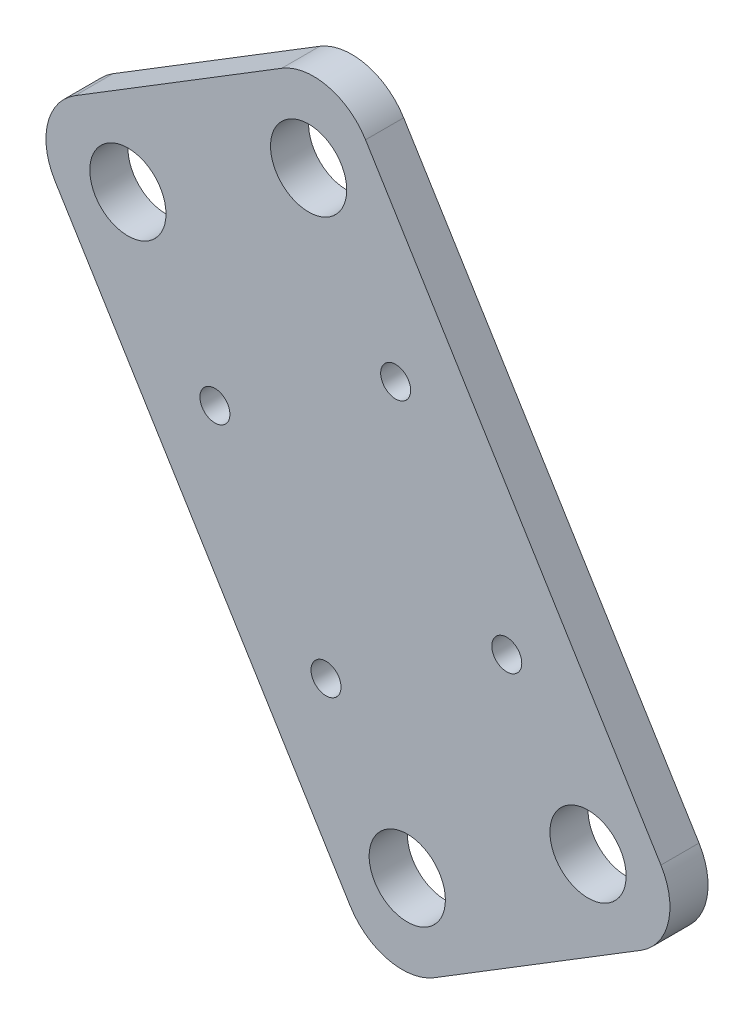
ISO-10303-21;
HEADER;
FILE_DESCRIPTION(('STEP AP214'),'2;1');
FILE_NAME('part.step','',(''),(''),'','','');
FILE_SCHEMA(('AUTOMOTIVE_DESIGN { 1 0 10303 214 1 1 1 1 }'));
ENDSEC;
DATA;
#1=APPLICATION_CONTEXT('core data for automotive mechanical design processes');
#2=APPLICATION_PROTOCOL_DEFINITION('international standard','automotive_design',2000,#1);
#3=PRODUCT_CONTEXT('',#1,'mechanical');
#4=PRODUCT('Part','Part','',(#3));
#5=PRODUCT_RELATED_PRODUCT_CATEGORY('part','',(#4));
#6=PRODUCT_DEFINITION_FORMATION('','',#4);
#7=PRODUCT_DEFINITION_CONTEXT('part definition',#1,'design');
#8=PRODUCT_DEFINITION('design','',#6,#7);
#9=PRODUCT_DEFINITION_SHAPE('','',#8);
#10=(LENGTH_UNIT() NAMED_UNIT(*) SI_UNIT(.MILLI.,.METRE.));
#11=(NAMED_UNIT(*) PLANE_ANGLE_UNIT() SI_UNIT($,.RADIAN.));
#12=(NAMED_UNIT(*) SI_UNIT($,.STERADIAN.) SOLID_ANGLE_UNIT());
#13=UNCERTAINTY_MEASURE_WITH_UNIT(LENGTH_MEASURE(1.E-05),#10,'distance_accuracy_value','');
#14=(GEOMETRIC_REPRESENTATION_CONTEXT(3) GLOBAL_UNCERTAINTY_ASSIGNED_CONTEXT((#13)) GLOBAL_UNIT_ASSIGNED_CONTEXT((#10,
#11,#12)) REPRESENTATION_CONTEXT('',''));
#15=CARTESIAN_POINT('',(0.,0.,0.));
#16=DIRECTION('',(0.,0.,1.));
#17=DIRECTION('',(1.,0.,0.));
#18=AXIS2_PLACEMENT_3D('',#15,#16,#17);
#19=CARTESIAN_POINT('',(-82.1083555414398,-162.941789071781,3.175));
#20=DIRECTION('',(0.,0.,-1.));
#21=DIRECTION('',(-1.,0.,0.));
#22=AXIS2_PLACEMENT_3D('',#19,#20,#21);
#23=CYLINDRICAL_SURFACE('',#22,5.08);
#24=CARTESIAN_POINT('',(-82.1083555414398,-162.941789071781,0.));
#25=DIRECTION('',(0.,0.,1.));
#26=DIRECTION('',(1.,0.,0.));
#27=AXIS2_PLACEMENT_3D('',#24,#25,#26);
#28=CIRCLE('',#27,5.08);
#29=CARTESIAN_POINT('',(-86.4359139950338,-165.602360031317,0.));
#30=VERTEX_POINT('',#29);
#31=CARTESIAN_POINT('',(-84.7689265009758,-158.614230618187,0.));
#32=VERTEX_POINT('',#31);
#33=EDGE_CURVE('E157',#30,#32,#28,.F.);
#34=ORIENTED_EDGE('',*,*,#33,.F.);
#35=DIRECTION('',(0.,0.,-1.));
#36=VECTOR('',#35,1.);
#37=CARTESIAN_POINT('',(-86.4359139950338,-165.602360031317,3.175));
#38=LINE('',#37,#36);
#39=CARTESIAN_POINT('',(-86.4359139950338,-165.602360031317,3.175));
#40=VERTEX_POINT('',#39);
#41=EDGE_CURVE('E11',#40,#30,#38,.T.);
#42=ORIENTED_EDGE('',*,*,#41,.F.);
#43=CARTESIAN_POINT('',(-82.1083555414398,-162.941789071781,3.175));
#44=DIRECTION('',(0.,0.,1.));
#45=DIRECTION('',(1.,0.,0.));
#46=AXIS2_PLACEMENT_3D('',#43,#44,#45);
#47=CIRCLE('',#46,5.08);
#48=CARTESIAN_POINT('',(-84.7689265009758,-158.614230618187,3.175));
#49=VERTEX_POINT('',#48);
#50=EDGE_CURVE('E273',#40,#49,#47,.F.);
#51=ORIENTED_EDGE('',*,*,#50,.T.);
#52=DIRECTION('',(0.,0.,-1.));
#53=VECTOR('',#52,1.);
#54=CARTESIAN_POINT('',(-84.7689265009758,-158.614230618187,3.175));
#55=LINE('',#54,#53);
#56=EDGE_CURVE('E90',#49,#32,#55,.T.);
#57=ORIENTED_EDGE('',*,*,#56,.T.);
#58=EDGE_LOOP('',(#34,#42,#51,#57));
#59=FACE_BOUND('',#58,.T.);
#60=ADVANCED_FACE('F39',(#59),#23,.T.);
#61=CARTESIAN_POINT('',(-136.611839550378,-83.9885808439331,3.175));
#62=DIRECTION('',(0.851881585353164,0.523734440853549,0.));
#63=DIRECTION('',(-0.523734440853549,0.851881585353164,0.));
#64=AXIS2_PLACEMENT_3D('',#61,#62,#63);
#65=PLANE('',#64);
#66=DIRECTION('',(0.523734440853549,-0.851881585353164,0.));
#67=VECTOR('',#66,1.);
#68=CARTESIAN_POINT('',(-136.611839550378,-83.9885808439331,0.));
#69=LINE('',#68,#67);
#70=CARTESIAN_POINT('',(-61.8256326193256,-205.632275727062,0.));
#71=VERTEX_POINT('',#70);
#72=EDGE_CURVE('E155',#30,#71,#69,.T.);
#73=ORIENTED_EDGE('',*,*,#72,.T.);
#74=DIRECTION('',(0.,0.,-1.));
#75=VECTOR('',#74,1.);
#76=CARTESIAN_POINT('',(-61.8256326193256,-205.632275727062,3.175));
#77=LINE('',#76,#75);
#78=CARTESIAN_POINT('',(-61.8256326193256,-205.632275727062,3.175));
#79=VERTEX_POINT('',#78);
#80=EDGE_CURVE('E48',#79,#71,#77,.T.);
#81=ORIENTED_EDGE('',*,*,#80,.F.);
#82=DIRECTION('',(0.523734440853549,-0.851881585353164,0.));
#83=VECTOR('',#82,1.);
#84=CARTESIAN_POINT('',(-136.611839550378,-83.9885808439331,3.175));
#85=LINE('',#84,#83);
#86=EDGE_CURVE('E275',#40,#79,#85,.T.);
#87=ORIENTED_EDGE('',*,*,#86,.F.);
#88=ORIENTED_EDGE('',*,*,#41,.T.);
#89=EDGE_LOOP('',(#73,#81,#87,#88));
#90=FACE_BOUND('',#89,.T.);
#91=ADVANCED_FACE('F156',(#90),#65,.F.);
#92=CARTESIAN_POINT('',(-57.4980741657315,-202.971704767526,3.175));
#93=DIRECTION('',(0.,0.,-1.));
#94=DIRECTION('',(-1.,0.,0.));
#95=AXIS2_PLACEMENT_3D('',#92,#93,#94);
#96=CYLINDRICAL_SURFACE('',#95,5.07999999999999);
#97=CARTESIAN_POINT('',(-57.4980741657315,-202.971704767526,0.));
#98=DIRECTION('',(0.,0.,1.));
#99=DIRECTION('',(1.,0.,0.));
#100=AXIS2_PLACEMENT_3D('',#97,#98,#99);
#101=CIRCLE('',#100,5.07999999999999);
#102=CARTESIAN_POINT('',(-54.8375032061955,-207.29926322112,0.));
#103=VERTEX_POINT('',#102);
#104=EDGE_CURVE('E149',#71,#103,#101,.T.);
#105=ORIENTED_EDGE('',*,*,#104,.T.);
#106=DIRECTION('',(0.,0.,-1.));
#107=VECTOR('',#106,1.);
#108=CARTESIAN_POINT('',(-54.8375032061955,-207.29926322112,3.175));
#109=LINE('',#108,#107);
#110=CARTESIAN_POINT('',(-54.8375032061955,-207.29926322112,3.175));
#111=VERTEX_POINT('',#110);
#112=EDGE_CURVE('E140',#111,#103,#109,.T.);
#113=ORIENTED_EDGE('',*,*,#112,.F.);
#114=CARTESIAN_POINT('',(-57.4980741657315,-202.971704767526,3.175));
#115=DIRECTION('',(0.,0.,1.));
#116=DIRECTION('',(1.,0.,0.));
#117=AXIS2_PLACEMENT_3D('',#114,#115,#116);
#118=CIRCLE('',#117,5.07999999999999);
#119=EDGE_CURVE('E151',#79,#111,#118,.T.);
#120=ORIENTED_EDGE('',*,*,#119,.F.);
#121=ORIENTED_EDGE('',*,*,#80,.T.);
#122=EDGE_LOOP('',(#105,#113,#120,#121));
#123=FACE_BOUND('',#122,.T.);
#124=ADVANCED_FACE('F147',(#123),#96,.T.);
#125=CARTESIAN_POINT('',(77.4467778905888,-125.971253336723,3.175));
#126=DIRECTION('',(-0.523734440853548,0.851881585353165,0.));
#127=DIRECTION('',(-0.851881585353165,-0.523734440853548,0.));
#128=AXIS2_PLACEMENT_3D('',#125,#126,#127);
#129=PLANE('',#128);
#130=DIRECTION('',(0.851881585353165,0.523734440853548,0.));
#131=VECTOR('',#130,1.);
#132=CARTESIAN_POINT('',(77.4467778905888,-125.971253336723,0.));
#133=LINE('',#132,#131);
#134=CARTESIAN_POINT('',(-37.6144428351193,-196.71057337464,0.));
#135=VERTEX_POINT('',#134);
#136=EDGE_CURVE('E159',#103,#135,#133,.T.);
#137=ORIENTED_EDGE('',*,*,#136,.T.);
#138=DIRECTION('',(0.,0.,-1.));
#139=VECTOR('',#138,1.);
#140=CARTESIAN_POINT('',(-37.6144428351193,-196.71057337464,3.175));
#141=LINE('',#140,#139);
#142=CARTESIAN_POINT('',(-37.6144428351193,-196.71057337464,3.175));
#143=VERTEX_POINT('',#142);
#144=EDGE_CURVE('E133',#143,#135,#141,.T.);
#145=ORIENTED_EDGE('',*,*,#144,.F.);
#146=DIRECTION('',(0.851881585353165,0.523734440853548,0.));
#147=VECTOR('',#146,1.);
#148=CARTESIAN_POINT('',(77.4467778905888,-125.971253336723,3.175));
#149=LINE('',#148,#147);
#150=EDGE_CURVE('E280',#111,#143,#149,.T.);
#151=ORIENTED_EDGE('',*,*,#150,.F.);
#152=ORIENTED_EDGE('',*,*,#112,.T.);
#153=EDGE_LOOP('',(#137,#145,#151,#152));
#154=FACE_BOUND('',#153,.T.);
#155=ADVANCED_FACE('F231',(#154),#129,.F.);
#156=CARTESIAN_POINT('',(-40.2750137946553,-192.383014921046,3.175));
#157=DIRECTION('',(0.,0.,-1.));
#158=DIRECTION('',(-1.,0.,0.));
#159=AXIS2_PLACEMENT_3D('',#156,#157,#158);
#160=CYLINDRICAL_SURFACE('',#159,5.08);
#161=CARTESIAN_POINT('',(-40.2750137946553,-192.383014921046,0.));
#162=DIRECTION('',(0.,0.,1.));
#163=DIRECTION('',(1.,0.,0.));
#164=AXIS2_PLACEMENT_3D('',#161,#162,#163);
#165=CIRCLE('',#164,5.08);
#166=CARTESIAN_POINT('',(-35.9474553410612,-189.722443961509,0.));
#167=VERTEX_POINT('',#166);
#168=EDGE_CURVE('E167',#135,#167,#165,.T.);
#169=ORIENTED_EDGE('',*,*,#168,.T.);
#170=DIRECTION('',(0.,0.,-1.));
#171=VECTOR('',#170,1.);
#172=CARTESIAN_POINT('',(-35.9474553410612,-189.722443961509,3.175));
#173=LINE('',#172,#171);
#174=CARTESIAN_POINT('',(-35.9474553410612,-189.722443961509,3.175));
#175=VERTEX_POINT('',#174);
#176=EDGE_CURVE('E131',#175,#167,#173,.T.);
#177=ORIENTED_EDGE('',*,*,#176,.F.);
#178=CARTESIAN_POINT('',(-40.2750137946553,-192.383014921046,3.175));
#179=DIRECTION('',(0.,0.,1.));
#180=DIRECTION('',(1.,0.,0.));
#181=AXIS2_PLACEMENT_3D('',#178,#179,#180);
#182=CIRCLE('',#181,5.08);
#183=EDGE_CURVE('E124',#143,#175,#182,.T.);
#184=ORIENTED_EDGE('',*,*,#183,.F.);
#185=ORIENTED_EDGE('',*,*,#144,.T.);
#186=EDGE_LOOP('',(#169,#177,#184,#185));
#187=FACE_BOUND('',#186,.T.);
#188=ADVANCED_FACE('F234',(#187),#160,.T.);
#189=CARTESIAN_POINT('',(-110.733662272114,-68.0787490783808,3.175));
#190=DIRECTION('',(-0.851881585353164,-0.523734440853549,0.));
#191=DIRECTION('',(0.523734440853549,-0.851881585353164,0.));
#192=AXIS2_PLACEMENT_3D('',#189,#190,#191);
#193=PLANE('',#192);
#194=DIRECTION('',(-0.523734440853549,0.851881585353164,0.));
#195=VECTOR('',#194,1.);
#196=CARTESIAN_POINT('',(-110.733662272114,-68.0787490783808,0.));
#197=LINE('',#196,#195);
#198=CARTESIAN_POINT('',(-60.5577367167694,-149.692528265764,0.));
#199=VERTEX_POINT('',#198);
#200=EDGE_CURVE('E130',#167,#199,#197,.T.);
#201=ORIENTED_EDGE('',*,*,#200,.T.);
#202=DIRECTION('',(0.,0.,-1.));
#203=VECTOR('',#202,1.);
#204=CARTESIAN_POINT('',(-60.5577367167694,-149.692528265764,3.175));
#205=LINE('',#204,#203);
#206=CARTESIAN_POINT('',(-60.5577367167694,-149.692528265764,3.175));
#207=VERTEX_POINT('',#206);
#208=EDGE_CURVE('E115',#207,#199,#205,.T.);
#209=ORIENTED_EDGE('',*,*,#208,.F.);
#210=DIRECTION('',(-0.523734440853549,0.851881585353164,0.));
#211=VECTOR('',#210,1.);
#212=CARTESIAN_POINT('',(-110.733662272114,-68.0787490783808,3.175));
#213=LINE('',#212,#211);
#214=EDGE_CURVE('E118',#175,#207,#213,.T.);
#215=ORIENTED_EDGE('',*,*,#214,.F.);
#216=ORIENTED_EDGE('',*,*,#176,.T.);
#217=EDGE_LOOP('',(#201,#209,#215,#216));
#218=FACE_BOUND('',#217,.T.);
#219=ADVANCED_FACE('F129',(#218),#193,.F.);
#220=CARTESIAN_POINT('',(-64.8852951703635,-152.3530992253,3.175));
#221=DIRECTION('',(0.,0.,-1.));
#222=DIRECTION('',(-1.,0.,0.));
#223=AXIS2_PLACEMENT_3D('',#220,#221,#222);
#224=CYLINDRICAL_SURFACE('',#223,5.07999999999999);
#225=CARTESIAN_POINT('',(-64.8852951703635,-152.3530992253,0.));
#226=DIRECTION('',(0.,0.,1.));
#227=DIRECTION('',(1.,0.,0.));
#228=AXIS2_PLACEMENT_3D('',#225,#226,#227);
#229=CIRCLE('',#228,5.07999999999999);
#230=CARTESIAN_POINT('',(-67.5458661298996,-148.025540771706,0.));
#231=VERTEX_POINT('',#230);
#232=EDGE_CURVE('E171',#199,#231,#229,.T.);
#233=ORIENTED_EDGE('',*,*,#232,.T.);
#234=DIRECTION('',(0.,0.,-1.));
#235=VECTOR('',#234,1.);
#236=CARTESIAN_POINT('',(-67.5458661298996,-148.025540771706,3.175));
#237=LINE('',#236,#235);
#238=CARTESIAN_POINT('',(-67.5458661298996,-148.025540771706,3.175));
#239=VERTEX_POINT('',#238);
#240=EDGE_CURVE('E117',#239,#231,#237,.T.);
#241=ORIENTED_EDGE('',*,*,#240,.F.);
#242=CARTESIAN_POINT('',(-64.8852951703635,-152.3530992253,3.175));
#243=DIRECTION('',(0.,0.,1.));
#244=DIRECTION('',(1.,0.,0.));
#245=AXIS2_PLACEMENT_3D('',#242,#243,#244);
#246=CIRCLE('',#245,5.07999999999999);
#247=EDGE_CURVE('E110',#207,#239,#246,.T.);
#248=ORIENTED_EDGE('',*,*,#247,.F.);
#249=ORIENTED_EDGE('',*,*,#208,.T.);
#250=EDGE_LOOP('',(#233,#241,#248,#249));
#251=FACE_BOUND('',#250,.T.);
#252=ADVANCED_FACE('F113',(#251),#224,.T.);
#253=CARTESIAN_POINT('',(-58.0500913940736,-165.895810332094,3.175));
#254=DIRECTION('',(0.,0.,-1.));
#255=DIRECTION('',(-1.,0.,0.));
#256=AXIS2_PLACEMENT_3D('',#253,#254,#255);
#257=CYLINDRICAL_SURFACE('',#256,1.25);
#258=CARTESIAN_POINT('',(-58.0500913940736,-165.895810332094,3.175));
#259=DIRECTION('',(0.,0.,1.));
#260=DIRECTION('',(1.,0.,0.));
#261=AXIS2_PLACEMENT_3D('',#258,#259,#260);
#262=CIRCLE('',#261,1.25);
#263=CARTESIAN_POINT('',(-56.8000913940736,-165.895810332094,3.175));
#264=VERTEX_POINT('',#263);
#265=EDGE_CURVE('E197',#264,#264,#262,.T.);
#266=ORIENTED_EDGE('',*,*,#265,.T.);
#267=EDGE_LOOP('',(#266));
#268=FACE_BOUND('',#267,.T.);
#269=CARTESIAN_POINT('',(-58.0500913940736,-165.895810332094,0.));
#270=DIRECTION('',(0.,0.,1.));
#271=DIRECTION('',(1.,0.,0.));
#272=AXIS2_PLACEMENT_3D('',#269,#270,#271);
#273=CIRCLE('',#272,1.25);
#274=CARTESIAN_POINT('',(-56.8000913940736,-165.895810332094,0.));
#275=VERTEX_POINT('',#274);
#276=EDGE_CURVE('E189',#275,#275,#273,.T.);
#277=ORIENTED_EDGE('',*,*,#276,.F.);
#278=EDGE_LOOP('',(#277));
#279=FACE_BOUND('',#278,.T.);
#280=ADVANCED_FACE('F242',(#268,#279),#257,.F.);
#281=CARTESIAN_POINT('',(-73.1093725383528,-175.154214698806,3.175));
#282=DIRECTION('',(0.,0.,-1.));
#283=DIRECTION('',(-1.,0.,0.));
#284=AXIS2_PLACEMENT_3D('',#281,#282,#283);
#285=CYLINDRICAL_SURFACE('',#284,1.25);
#286=CARTESIAN_POINT('',(-73.1093725383528,-175.154214698806,3.175));
#287=DIRECTION('',(0.,0.,1.));
#288=DIRECTION('',(1.,0.,0.));
#289=AXIS2_PLACEMENT_3D('',#286,#287,#288);
#290=CIRCLE('',#289,1.25);
#291=CARTESIAN_POINT('',(-71.8593725383528,-175.154214698806,3.175));
#292=VERTEX_POINT('',#291);
#293=EDGE_CURVE('E202',#292,#292,#290,.T.);
#294=ORIENTED_EDGE('',*,*,#293,.T.);
#295=EDGE_LOOP('',(#294));
#296=FACE_BOUND('',#295,.T.);
#297=CARTESIAN_POINT('',(-73.1093725383528,-175.154214698806,0.));
#298=DIRECTION('',(0.,0.,1.));
#299=DIRECTION('',(1.,0.,0.));
#300=AXIS2_PLACEMENT_3D('',#297,#298,#299);
#301=CIRCLE('',#300,1.25);
#302=CARTESIAN_POINT('',(-71.8593725383528,-175.154214698806,0.));
#303=VERTEX_POINT('',#302);
#304=EDGE_CURVE('E186',#303,#303,#301,.T.);
#305=ORIENTED_EDGE('',*,*,#304,.F.);
#306=EDGE_LOOP('',(#305));
#307=FACE_BOUND('',#306,.T.);
#308=ADVANCED_FACE('F258',(#296,#307),#285,.F.);
#309=CARTESIAN_POINT('',(-80.3613231881573,-163.358535945295,3.175));
#310=DIRECTION('',(0.,0.,-1.));
#311=DIRECTION('',(-1.,0.,0.));
#312=AXIS2_PLACEMENT_3D('',#309,#310,#311);
#313=CYLINDRICAL_SURFACE('',#312,3.175);
#314=CARTESIAN_POINT('',(-80.3613231881573,-163.358535945295,3.175));
#315=DIRECTION('',(0.,0.,1.));
#316=DIRECTION('',(1.,0.,0.));
#317=AXIS2_PLACEMENT_3D('',#314,#315,#316);
#318=CIRCLE('',#317,3.175);
#319=CARTESIAN_POINT('',(-77.1863231881573,-163.358535945295,3.175));
#320=VERTEX_POINT('',#319);
#321=EDGE_CURVE('E293',#320,#320,#318,.T.);
#322=ORIENTED_EDGE('',*,*,#321,.T.);
#323=EDGE_LOOP('',(#322));
#324=FACE_BOUND('',#323,.T.);
#325=CARTESIAN_POINT('',(-80.3613231881573,-163.358535945295,0.));
#326=DIRECTION('',(0.,0.,1.));
#327=DIRECTION('',(1.,0.,0.));
#328=AXIS2_PLACEMENT_3D('',#325,#326,#327);
#329=CIRCLE('',#328,3.175);
#330=CARTESIAN_POINT('',(-77.1863231881573,-163.358535945295,0.));
#331=VERTEX_POINT('',#330);
#332=EDGE_CURVE('E183',#331,#331,#329,.T.);
#333=ORIENTED_EDGE('',*,*,#332,.F.);
#334=EDGE_LOOP('',(#333));
#335=FACE_BOUND('',#334,.T.);
#336=ADVANCED_FACE('F254',(#324,#335),#313,.F.);
#337=CARTESIAN_POINT('',(-65.302042043878,-154.100131578583,3.175));
#338=DIRECTION('',(0.,0.,-1.));
#339=DIRECTION('',(-1.,0.,0.));
#340=AXIS2_PLACEMENT_3D('',#337,#338,#339);
#341=CYLINDRICAL_SURFACE('',#340,3.175);
#342=CARTESIAN_POINT('',(-65.302042043878,-154.100131578583,3.175));
#343=DIRECTION('',(0.,0.,1.));
#344=DIRECTION('',(1.,0.,0.));
#345=AXIS2_PLACEMENT_3D('',#342,#343,#344);
#346=CIRCLE('',#345,3.175);
#347=CARTESIAN_POINT('',(-62.127042043878,-154.100131578583,3.175));
#348=VERTEX_POINT('',#347);
#349=EDGE_CURVE('E290',#348,#348,#346,.T.);
#350=ORIENTED_EDGE('',*,*,#349,.T.);
#351=EDGE_LOOP('',(#350));
#352=FACE_BOUND('',#351,.T.);
#353=CARTESIAN_POINT('',(-65.302042043878,-154.100131578583,0.));
#354=DIRECTION('',(0.,0.,1.));
#355=DIRECTION('',(1.,0.,0.));
#356=AXIS2_PLACEMENT_3D('',#353,#354,#355);
#357=CIRCLE('',#356,3.175);
#358=CARTESIAN_POINT('',(-62.127042043878,-154.100131578583,0.));
#359=VERTEX_POINT('',#358);
#360=EDGE_CURVE('E180',#359,#359,#357,.T.);
#361=ORIENTED_EDGE('',*,*,#360,.F.);
#362=EDGE_LOOP('',(#361));
#363=FACE_BOUND('',#362,.T.);
#364=ADVANCED_FACE('F250',(#352,#363),#341,.F.);
#365=CARTESIAN_POINT('',(-42.0220461479378,-191.966268047531,3.175));
#366=DIRECTION('',(0.,0.,-1.));
#367=DIRECTION('',(-1.,0.,0.));
#368=AXIS2_PLACEMENT_3D('',#365,#366,#367);
#369=CYLINDRICAL_SURFACE('',#368,3.175);
#370=CARTESIAN_POINT('',(-42.0220461479378,-191.966268047531,3.175));
#371=DIRECTION('',(0.,0.,1.));
#372=DIRECTION('',(1.,0.,0.));
#373=AXIS2_PLACEMENT_3D('',#370,#371,#372);
#374=CIRCLE('',#373,3.175);
#375=CARTESIAN_POINT('',(-38.8470461479378,-191.966268047531,3.175));
#376=VERTEX_POINT('',#375);
#377=EDGE_CURVE('E287',#376,#376,#374,.T.);
#378=ORIENTED_EDGE('',*,*,#377,.T.);
#379=EDGE_LOOP('',(#378));
#380=FACE_BOUND('',#379,.T.);
#381=CARTESIAN_POINT('',(-42.0220461479378,-191.966268047531,0.));
#382=DIRECTION('',(0.,0.,1.));
#383=DIRECTION('',(1.,0.,0.));
#384=AXIS2_PLACEMENT_3D('',#381,#382,#383);
#385=CIRCLE('',#384,3.175);
#386=CARTESIAN_POINT('',(-38.8470461479378,-191.966268047531,0.));
#387=VERTEX_POINT('',#386);
#388=EDGE_CURVE('E177',#387,#387,#385,.T.);
#389=ORIENTED_EDGE('',*,*,#388,.F.);
#390=EDGE_LOOP('',(#389));
#391=FACE_BOUND('',#390,.T.);
#392=ADVANCED_FACE('F246',(#380,#391),#369,.F.);
#393=CARTESIAN_POINT('',(-57.081327292217,-201.224672414243,3.175));
#394=DIRECTION('',(0.,0.,-1.));
#395=DIRECTION('',(-1.,0.,0.));
#396=AXIS2_PLACEMENT_3D('',#393,#394,#395);
#397=CYLINDRICAL_SURFACE('',#396,3.175);
#398=CARTESIAN_POINT('',(-57.081327292217,-201.224672414243,3.175));
#399=DIRECTION('',(0.,0.,1.));
#400=DIRECTION('',(1.,0.,0.));
#401=AXIS2_PLACEMENT_3D('',#398,#399,#400);
#402=CIRCLE('',#401,3.175);
#403=CARTESIAN_POINT('',(-53.906327292217,-201.224672414243,3.175));
#404=VERTEX_POINT('',#403);
#405=EDGE_CURVE('E284',#404,#404,#402,.T.);
#406=ORIENTED_EDGE('',*,*,#405,.T.);
#407=EDGE_LOOP('',(#406));
#408=FACE_BOUND('',#407,.T.);
#409=CARTESIAN_POINT('',(-57.081327292217,-201.224672414243,0.));
#410=DIRECTION('',(0.,0.,1.));
#411=DIRECTION('',(1.,0.,0.));
#412=AXIS2_PLACEMENT_3D('',#409,#410,#411);
#413=CIRCLE('',#412,3.175);
#414=CARTESIAN_POINT('',(-53.906327292217,-201.224672414243,0.));
#415=VERTEX_POINT('',#414);
#416=EDGE_CURVE('E174',#415,#415,#413,.T.);
#417=ORIENTED_EDGE('',*,*,#416,.F.);
#418=EDGE_LOOP('',(#417));
#419=FACE_BOUND('',#418,.T.);
#420=ADVANCED_FACE('F219',(#408,#419),#397,.F.);
#421=CARTESIAN_POINT('',(47.5153545958086,-77.2862207337896,3.175));
#422=DIRECTION('',(0.523734440853548,-0.851881585353165,0.));
#423=DIRECTION('',(0.851881585353165,0.523734440853548,0.));
#424=AXIS2_PLACEMENT_3D('',#421,#422,#423);
#425=PLANE('',#424);
#426=DIRECTION('',(-0.851881585353165,-0.523734440853548,0.));
#427=VECTOR('',#426,1.);
#428=CARTESIAN_POINT('',(47.5153545958086,-77.2862207337896,0.));
#429=LINE('',#428,#427);
#430=EDGE_CURVE('E83',#231,#32,#429,.T.);
#431=ORIENTED_EDGE('',*,*,#430,.T.);
#432=ORIENTED_EDGE('',*,*,#56,.F.);
#433=DIRECTION('',(-0.851881585353165,-0.523734440853548,0.));
#434=VECTOR('',#433,1.);
#435=CARTESIAN_POINT('',(47.5153545958086,-77.2862207337896,3.175));
#436=LINE('',#435,#434);
#437=EDGE_CURVE('E56',#239,#49,#436,.T.);
#438=ORIENTED_EDGE('',*,*,#437,.F.);
#439=ORIENTED_EDGE('',*,*,#240,.T.);
#440=EDGE_LOOP('',(#431,#432,#438,#439));
#441=FACE_BOUND('',#440,.T.);
#442=ADVANCED_FACE('F212',(#441),#425,.F.);
#443=CARTESIAN_POINT('',(-48.7916870273613,-180.955091476373,3.175));
#444=DIRECTION('',(0.,0.,-1.));
#445=DIRECTION('',(-1.,0.,0.));
#446=AXIS2_PLACEMENT_3D('',#443,#444,#445);
#447=CYLINDRICAL_SURFACE('',#446,1.25);
#448=CARTESIAN_POINT('',(-48.7916870273613,-180.955091476373,3.175));
#449=DIRECTION('',(0.,0.,1.));
#450=DIRECTION('',(1.,0.,0.));
#451=AXIS2_PLACEMENT_3D('',#448,#449,#450);
#452=CIRCLE('',#451,1.25);
#453=CARTESIAN_POINT('',(-47.5416870273613,-180.955091476373,3.175));
#454=VERTEX_POINT('',#453);
#455=EDGE_CURVE('E194',#454,#454,#452,.T.);
#456=ORIENTED_EDGE('',*,*,#455,.T.);
#457=EDGE_LOOP('',(#456));
#458=FACE_BOUND('',#457,.T.);
#459=CARTESIAN_POINT('',(-48.7916870273613,-180.955091476373,0.));
#460=DIRECTION('',(0.,0.,1.));
#461=DIRECTION('',(1.,0.,0.));
#462=AXIS2_PLACEMENT_3D('',#459,#460,#461);
#463=CIRCLE('',#462,1.25);
#464=CARTESIAN_POINT('',(-47.5416870273613,-180.955091476373,0.));
#465=VERTEX_POINT('',#464);
#466=EDGE_CURVE('E161',#465,#465,#463,.T.);
#467=ORIENTED_EDGE('',*,*,#466,.F.);
#468=EDGE_LOOP('',(#467));
#469=FACE_BOUND('',#468,.T.);
#470=ADVANCED_FACE('F41',(#458,#469),#447,.F.);
#471=CARTESIAN_POINT('',(-63.8509681716406,-190.213495843086,3.175));
#472=DIRECTION('',(0.,0.,-1.));
#473=DIRECTION('',(-1.,0.,0.));
#474=AXIS2_PLACEMENT_3D('',#471,#472,#473);
#475=CYLINDRICAL_SURFACE('',#474,1.25);
#476=CARTESIAN_POINT('',(-63.8509681716406,-190.213495843086,3.175));
#477=DIRECTION('',(0.,0.,1.));
#478=DIRECTION('',(1.,0.,0.));
#479=AXIS2_PLACEMENT_3D('',#476,#477,#478);
#480=CIRCLE('',#479,1.25);
#481=CARTESIAN_POINT('',(-62.6009681716406,-190.213495843086,3.175));
#482=VERTEX_POINT('',#481);
#483=EDGE_CURVE('E195',#482,#482,#480,.T.);
#484=ORIENTED_EDGE('',*,*,#483,.T.);
#485=EDGE_LOOP('',(#484));
#486=FACE_BOUND('',#485,.T.);
#487=CARTESIAN_POINT('',(-63.8509681716406,-190.213495843086,0.));
#488=DIRECTION('',(0.,0.,1.));
#489=DIRECTION('',(1.,0.,0.));
#490=AXIS2_PLACEMENT_3D('',#487,#488,#489);
#491=CIRCLE('',#490,1.25);
#492=CARTESIAN_POINT('',(-62.6009681716406,-190.213495843086,0.));
#493=VERTEX_POINT('',#492);
#494=EDGE_CURVE('E192',#493,#493,#491,.T.);
#495=ORIENTED_EDGE('',*,*,#494,.F.);
#496=EDGE_LOOP('',(#495));
#497=FACE_BOUND('',#496,.T.);
#498=ADVANCED_FACE('F211',(#486,#497),#475,.F.);
#499=CARTESIAN_POINT('',(0.,0.,3.175));
#500=DIRECTION('',(0.,0.,1.));
#501=DIRECTION('',(1.,0.,0.));
#502=AXIS2_PLACEMENT_3D('',#499,#500,#501);
#503=PLANE('',#502);
#504=ORIENTED_EDGE('',*,*,#455,.F.);
#505=EDGE_LOOP('',(#504));
#506=FACE_BOUND('',#505,.T.);
#507=ORIENTED_EDGE('',*,*,#50,.F.);
#508=ORIENTED_EDGE('',*,*,#86,.T.);
#509=ORIENTED_EDGE('',*,*,#119,.T.);
#510=ORIENTED_EDGE('',*,*,#150,.T.);
#511=ORIENTED_EDGE('',*,*,#183,.T.);
#512=ORIENTED_EDGE('',*,*,#214,.T.);
#513=ORIENTED_EDGE('',*,*,#247,.T.);
#514=ORIENTED_EDGE('',*,*,#437,.T.);
#515=EDGE_LOOP('',(#507,#508,#509,#510,#511,#512,#513,#514));
#516=FACE_BOUND('',#515,.T.);
#517=ORIENTED_EDGE('',*,*,#405,.F.);
#518=EDGE_LOOP('',(#517));
#519=FACE_BOUND('',#518,.T.);
#520=ORIENTED_EDGE('',*,*,#377,.F.);
#521=EDGE_LOOP('',(#520));
#522=FACE_BOUND('',#521,.T.);
#523=ORIENTED_EDGE('',*,*,#349,.F.);
#524=EDGE_LOOP('',(#523));
#525=FACE_BOUND('',#524,.T.);
#526=ORIENTED_EDGE('',*,*,#321,.F.);
#527=EDGE_LOOP('',(#526));
#528=FACE_BOUND('',#527,.T.);
#529=ORIENTED_EDGE('',*,*,#293,.F.);
#530=EDGE_LOOP('',(#529));
#531=FACE_BOUND('',#530,.T.);
#532=ORIENTED_EDGE('',*,*,#265,.F.);
#533=EDGE_LOOP('',(#532));
#534=FACE_BOUND('',#533,.T.);
#535=ORIENTED_EDGE('',*,*,#483,.F.);
#536=EDGE_LOOP('',(#535));
#537=FACE_BOUND('',#536,.T.);
#538=ADVANCED_FACE('F121',(#506,#516,#519,#522,#525,#528,#531,#534,#537),#503,.T.);
#539=CARTESIAN_POINT('',(0.,0.,0.));
#540=DIRECTION('',(0.,0.,1.));
#541=DIRECTION('',(1.,0.,0.));
#542=AXIS2_PLACEMENT_3D('',#539,#540,#541);
#543=PLANE('',#542);
#544=ORIENTED_EDGE('',*,*,#466,.T.);
#545=EDGE_LOOP('',(#544));
#546=FACE_BOUND('',#545,.T.);
#547=ORIENTED_EDGE('',*,*,#33,.T.);
#548=ORIENTED_EDGE('',*,*,#430,.F.);
#549=ORIENTED_EDGE('',*,*,#232,.F.);
#550=ORIENTED_EDGE('',*,*,#200,.F.);
#551=ORIENTED_EDGE('',*,*,#168,.F.);
#552=ORIENTED_EDGE('',*,*,#136,.F.);
#553=ORIENTED_EDGE('',*,*,#104,.F.);
#554=ORIENTED_EDGE('',*,*,#72,.F.);
#555=EDGE_LOOP('',(#547,#548,#549,#550,#551,#552,#553,#554));
#556=FACE_BOUND('',#555,.T.);
#557=ORIENTED_EDGE('',*,*,#416,.T.);
#558=EDGE_LOOP('',(#557));
#559=FACE_BOUND('',#558,.T.);
#560=ORIENTED_EDGE('',*,*,#388,.T.);
#561=EDGE_LOOP('',(#560));
#562=FACE_BOUND('',#561,.T.);
#563=ORIENTED_EDGE('',*,*,#360,.T.);
#564=EDGE_LOOP('',(#563));
#565=FACE_BOUND('',#564,.T.);
#566=ORIENTED_EDGE('',*,*,#332,.T.);
#567=EDGE_LOOP('',(#566));
#568=FACE_BOUND('',#567,.T.);
#569=ORIENTED_EDGE('',*,*,#304,.T.);
#570=EDGE_LOOP('',(#569));
#571=FACE_BOUND('',#570,.T.);
#572=ORIENTED_EDGE('',*,*,#276,.T.);
#573=EDGE_LOOP('',(#572));
#574=FACE_BOUND('',#573,.T.);
#575=ORIENTED_EDGE('',*,*,#494,.T.);
#576=EDGE_LOOP('',(#575));
#577=FACE_BOUND('',#576,.T.);
#578=ADVANCED_FACE('F208',(#546,#556,#559,#562,#565,#568,#571,#574,#577),#543,.F.);
#579=CLOSED_SHELL('',(#60,#91,#124,#155,#188,#219,#252,#280,#308,#336,#364,#392,#420,#442,#470,
#498,#538,#578));
#580=MANIFOLD_SOLID_BREP('B2',#579);
#581=ADVANCED_BREP_SHAPE_REPRESENTATION('',(#18,#580),#14);
#582=SHAPE_DEFINITION_REPRESENTATION(#9,#581);
ENDSEC;
END-ISO-10303-21;
